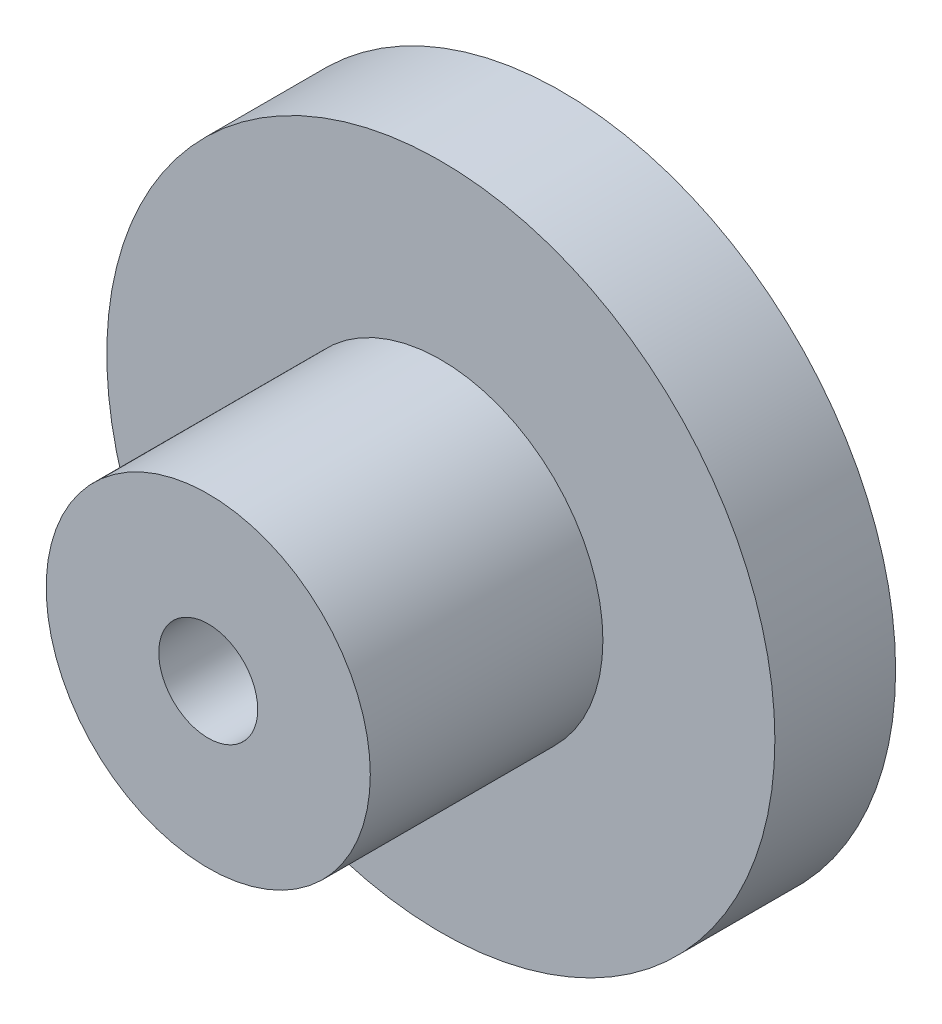
ISO-10303-21;
HEADER;
FILE_DESCRIPTION(('STEP AP214'),'2;1');
FILE_NAME('part.step','',(''),(''),'','','');
FILE_SCHEMA(('AUTOMOTIVE_DESIGN { 1 0 10303 214 1 1 1 1 }'));
ENDSEC;
DATA;
#1=APPLICATION_CONTEXT('core data for automotive mechanical design processes');
#2=APPLICATION_PROTOCOL_DEFINITION('international standard','automotive_design',2000,#1);
#3=PRODUCT_CONTEXT('',#1,'mechanical');
#4=PRODUCT('Part','Part','',(#3));
#5=PRODUCT_RELATED_PRODUCT_CATEGORY('part','',(#4));
#6=PRODUCT_DEFINITION_FORMATION('','',#4);
#7=PRODUCT_DEFINITION_CONTEXT('part definition',#1,'design');
#8=PRODUCT_DEFINITION('design','',#6,#7);
#9=PRODUCT_DEFINITION_SHAPE('','',#8);
#10=(LENGTH_UNIT() NAMED_UNIT(*) SI_UNIT(.MILLI.,.METRE.));
#11=(NAMED_UNIT(*) PLANE_ANGLE_UNIT() SI_UNIT($,.RADIAN.));
#12=(NAMED_UNIT(*) SI_UNIT($,.STERADIAN.) SOLID_ANGLE_UNIT());
#13=UNCERTAINTY_MEASURE_WITH_UNIT(LENGTH_MEASURE(1.E-05),#10,'distance_accuracy_value','');
#14=(GEOMETRIC_REPRESENTATION_CONTEXT(3) GLOBAL_UNCERTAINTY_ASSIGNED_CONTEXT((#13)) GLOBAL_UNIT_ASSIGNED_CONTEXT((#10,
#11,#12)) REPRESENTATION_CONTEXT('',''));
#15=CARTESIAN_POINT('',(0.,0.,0.));
#16=DIRECTION('',(0.,0.,1.));
#17=DIRECTION('',(1.,0.,0.));
#18=AXIS2_PLACEMENT_3D('',#15,#16,#17);
#19=CARTESIAN_POINT('',(0.,0.,2.44));
#20=DIRECTION('',(0.,0.,-1.));
#21=DIRECTION('',(-1.,0.,0.));
#22=AXIS2_PLACEMENT_3D('',#19,#20,#21);
#23=CYLINDRICAL_SURFACE('',#22,6.75);
#24=CARTESIAN_POINT('',(0.,0.,2.44));
#25=DIRECTION('',(0.,0.,1.));
#26=DIRECTION('',(1.,0.,0.));
#27=AXIS2_PLACEMENT_3D('',#24,#25,#26);
#28=CIRCLE('',#27,6.75);
#29=CARTESIAN_POINT('',(6.75,0.,2.44));
#30=VERTEX_POINT('',#29);
#31=EDGE_CURVE('E46',#30,#30,#28,.T.);
#32=ORIENTED_EDGE('',*,*,#31,.F.);
#33=EDGE_LOOP('',(#32));
#34=FACE_BOUND('',#33,.T.);
#35=CARTESIAN_POINT('',(0.,0.,0.));
#36=DIRECTION('',(0.,0.,1.));
#37=DIRECTION('',(1.,0.,0.));
#38=AXIS2_PLACEMENT_3D('',#35,#36,#37);
#39=CIRCLE('',#38,6.75);
#40=CARTESIAN_POINT('',(6.75,0.,0.));
#41=VERTEX_POINT('',#40);
#42=EDGE_CURVE('E42',#41,#41,#39,.T.);
#43=ORIENTED_EDGE('',*,*,#42,.T.);
#44=EDGE_LOOP('',(#43));
#45=FACE_BOUND('',#44,.T.);
#46=ADVANCED_FACE('F39',(#34,#45),#23,.T.);
#47=CARTESIAN_POINT('',(0.,0.,2.44));
#48=DIRECTION('',(0.,0.,1.));
#49=DIRECTION('',(1.,0.,0.));
#50=AXIS2_PLACEMENT_3D('',#47,#48,#49);
#51=PLANE('',#50);
#52=CARTESIAN_POINT('',(0.,0.,2.44));
#53=DIRECTION('',(0.,0.,1.));
#54=DIRECTION('',(1.,0.,0.));
#55=AXIS2_PLACEMENT_3D('',#52,#53,#54);
#56=CIRCLE('',#55,3.275);
#57=CARTESIAN_POINT('',(3.275,0.,2.44));
#58=VERTEX_POINT('',#57);
#59=EDGE_CURVE('E10',#58,#58,#56,.T.);
#60=ORIENTED_EDGE('',*,*,#59,.F.);
#61=EDGE_LOOP('',(#60));
#62=FACE_BOUND('',#61,.T.);
#63=ORIENTED_EDGE('',*,*,#31,.T.);
#64=EDGE_LOOP('',(#63));
#65=FACE_BOUND('',#64,.T.);
#66=ADVANCED_FACE('F83',(#62,#65),#51,.T.);
#67=CARTESIAN_POINT('',(0.,0.,0.));
#68=DIRECTION('',(0.,0.,1.));
#69=DIRECTION('',(1.,0.,0.));
#70=AXIS2_PLACEMENT_3D('',#67,#68,#69);
#71=PLANE('',#70);
#72=CARTESIAN_POINT('',(0.,0.,0.));
#73=DIRECTION('',(0.,0.,1.));
#74=DIRECTION('',(1.,0.,0.));
#75=AXIS2_PLACEMENT_3D('',#72,#73,#74);
#76=CIRCLE('',#75,1.);
#77=CARTESIAN_POINT('',(1.,0.,0.));
#78=VERTEX_POINT('',#77);
#79=EDGE_CURVE('E55',#78,#78,#76,.T.);
#80=ORIENTED_EDGE('',*,*,#79,.T.);
#81=EDGE_LOOP('',(#80));
#82=FACE_BOUND('',#81,.T.);
#83=ORIENTED_EDGE('',*,*,#42,.F.);
#84=EDGE_LOOP('',(#83));
#85=FACE_BOUND('',#84,.T.);
#86=ADVANCED_FACE('F62',(#82,#85),#71,.F.);
#87=CARTESIAN_POINT('',(0.,0.,7.14));
#88=DIRECTION('',(0.,0.,-1.));
#89=DIRECTION('',(-1.,0.,0.));
#90=AXIS2_PLACEMENT_3D('',#87,#88,#89);
#91=CYLINDRICAL_SURFACE('',#90,3.275);
#92=CARTESIAN_POINT('',(0.,0.,7.14));
#93=DIRECTION('',(0.,0.,1.));
#94=DIRECTION('',(1.,0.,0.));
#95=AXIS2_PLACEMENT_3D('',#92,#93,#94);
#96=CIRCLE('',#95,3.275);
#97=CARTESIAN_POINT('',(3.275,0.,7.14));
#98=VERTEX_POINT('',#97);
#99=EDGE_CURVE('E52',#98,#98,#96,.T.);
#100=ORIENTED_EDGE('',*,*,#99,.F.);
#101=EDGE_LOOP('',(#100));
#102=FACE_BOUND('',#101,.T.);
#103=ORIENTED_EDGE('',*,*,#59,.T.);
#104=EDGE_LOOP('',(#103));
#105=FACE_BOUND('',#104,.T.);
#106=ADVANCED_FACE('F74',(#102,#105),#91,.T.);
#107=CARTESIAN_POINT('',(0.,0.,7.14));
#108=DIRECTION('',(0.,0.,1.));
#109=DIRECTION('',(1.,0.,0.));
#110=AXIS2_PLACEMENT_3D('',#107,#108,#109);
#111=PLANE('',#110);
#112=CARTESIAN_POINT('',(0.,0.,7.14));
#113=DIRECTION('',(0.,0.,1.));
#114=DIRECTION('',(1.,0.,0.));
#115=AXIS2_PLACEMENT_3D('',#112,#113,#114);
#116=CIRCLE('',#115,1.);
#117=CARTESIAN_POINT('',(1.,0.,7.14));
#118=VERTEX_POINT('',#117);
#119=EDGE_CURVE('E56',#118,#118,#116,.T.);
#120=ORIENTED_EDGE('',*,*,#119,.F.);
#121=EDGE_LOOP('',(#120));
#122=FACE_BOUND('',#121,.T.);
#123=ORIENTED_EDGE('',*,*,#99,.T.);
#124=EDGE_LOOP('',(#123));
#125=FACE_BOUND('',#124,.T.);
#126=ADVANCED_FACE('F68',(#122,#125),#111,.T.);
#127=CARTESIAN_POINT('',(0.,0.,0.));
#128=DIRECTION('',(0.,0.,1.));
#129=DIRECTION('',(1.,0.,0.));
#130=AXIS2_PLACEMENT_3D('',#127,#128,#129);
#131=CYLINDRICAL_SURFACE('',#130,1.);
#132=ORIENTED_EDGE('',*,*,#79,.F.);
#133=EDGE_LOOP('',(#132));
#134=FACE_BOUND('',#133,.T.);
#135=ORIENTED_EDGE('',*,*,#119,.T.);
#136=EDGE_LOOP('',(#135));
#137=FACE_BOUND('',#136,.T.);
#138=ADVANCED_FACE('F65',(#134,#137),#131,.F.);
#139=CLOSED_SHELL('',(#46,#66,#86,#106,#126,#138));
#140=MANIFOLD_SOLID_BREP('B2',#139);
#141=ADVANCED_BREP_SHAPE_REPRESENTATION('',(#18,#140),#14);
#142=SHAPE_DEFINITION_REPRESENTATION(#9,#141);
ENDSEC;
END-ISO-10303-21;
